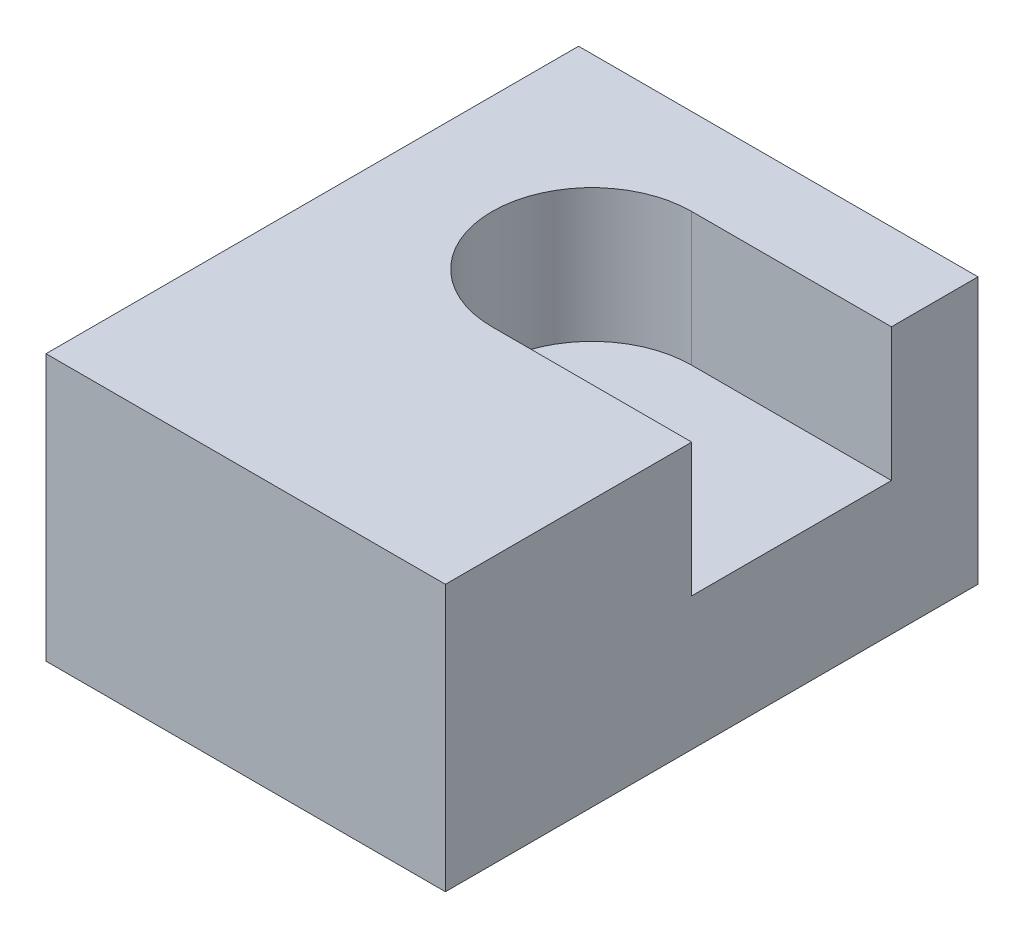
ISO-10303-21;
HEADER;
FILE_DESCRIPTION(('STEP AP214'),'2;1');
FILE_NAME('part.step','',(''),(''),'','','');
FILE_SCHEMA(('AUTOMOTIVE_DESIGN { 1 0 10303 214 1 1 1 1 }'));
ENDSEC;
DATA;
#1=APPLICATION_CONTEXT('core data for automotive mechanical design processes');
#2=APPLICATION_PROTOCOL_DEFINITION('international standard','automotive_design',2000,#1);
#3=PRODUCT_CONTEXT('',#1,'mechanical');
#4=PRODUCT('Part','Part','',(#3));
#5=PRODUCT_RELATED_PRODUCT_CATEGORY('part','',(#4));
#6=PRODUCT_DEFINITION_FORMATION('','',#4);
#7=PRODUCT_DEFINITION_CONTEXT('part definition',#1,'design');
#8=PRODUCT_DEFINITION('design','',#6,#7);
#9=PRODUCT_DEFINITION_SHAPE('','',#8);
#10=(LENGTH_UNIT() NAMED_UNIT(*) SI_UNIT(.MILLI.,.METRE.));
#11=(NAMED_UNIT(*) PLANE_ANGLE_UNIT() SI_UNIT($,.RADIAN.));
#12=(NAMED_UNIT(*) SI_UNIT($,.STERADIAN.) SOLID_ANGLE_UNIT());
#13=UNCERTAINTY_MEASURE_WITH_UNIT(LENGTH_MEASURE(1.E-05),#10,'distance_accuracy_value','');
#14=(GEOMETRIC_REPRESENTATION_CONTEXT(3) GLOBAL_UNCERTAINTY_ASSIGNED_CONTEXT((#13)) GLOBAL_UNIT_ASSIGNED_CONTEXT((#10,
#11,#12)) REPRESENTATION_CONTEXT('',''));
#15=CARTESIAN_POINT('',(0.,0.,0.));
#16=DIRECTION('',(0.,0.,1.));
#17=DIRECTION('',(1.,0.,0.));
#18=AXIS2_PLACEMENT_3D('',#15,#16,#17);
#19=CARTESIAN_POINT('',(19.05,12.7,50.8));
#20=DIRECTION('',(-1.,0.,0.));
#21=DIRECTION('',(0.,0.,1.));
#22=AXIS2_PLACEMENT_3D('',#19,#20,#21);
#23=PLANE('',#22);
#24=DIRECTION('',(0.,0.,-1.));
#25=VECTOR('',#24,1.);
#26=CARTESIAN_POINT('',(19.05,0.,27.305));
#27=LINE('',#26,#25);
#28=CARTESIAN_POINT('',(19.05,0.,27.305));
#29=VERTEX_POINT('',#28);
#30=CARTESIAN_POINT('',(19.05,0.,8.25499999999999));
#31=VERTEX_POINT('',#30);
#32=EDGE_CURVE('E114',#29,#31,#27,.T.);
#33=ORIENTED_EDGE('',*,*,#32,.F.);
#34=DIRECTION('',(0.,1.,0.));
#35=VECTOR('',#34,1.);
#36=CARTESIAN_POINT('',(19.05,0.,27.305));
#37=LINE('',#36,#35);
#38=CARTESIAN_POINT('',(19.05,12.7,27.305));
#39=VERTEX_POINT('',#38);
#40=EDGE_CURVE('E143',#29,#39,#37,.T.);
#41=ORIENTED_EDGE('',*,*,#40,.T.);
#42=DIRECTION('',(0.,0.,-1.));
#43=VECTOR('',#42,1.);
#44=CARTESIAN_POINT('',(19.05,12.7,50.8));
#45=LINE('',#44,#43);
#46=CARTESIAN_POINT('',(19.05,12.7,50.8));
#47=VERTEX_POINT('',#46);
#48=EDGE_CURVE('E11',#47,#39,#45,.T.);
#49=ORIENTED_EDGE('',*,*,#48,.F.);
#50=DIRECTION('',(0.,1.,0.));
#51=VECTOR('',#50,1.);
#52=CARTESIAN_POINT('',(19.05,12.7,50.8));
#53=LINE('',#52,#51);
#54=CARTESIAN_POINT('',(19.05,-12.7,50.8));
#55=VERTEX_POINT('',#54);
#56=EDGE_CURVE('E133',#55,#47,#53,.T.);
#57=ORIENTED_EDGE('',*,*,#56,.F.);
#58=DIRECTION('',(0.,0.,-1.));
#59=VECTOR('',#58,1.);
#60=CARTESIAN_POINT('',(19.05,-12.7,50.8));
#61=LINE('',#60,#59);
#62=CARTESIAN_POINT('',(19.05,-12.7,0.));
#63=VERTEX_POINT('',#62);
#64=EDGE_CURVE('E139',#55,#63,#61,.T.);
#65=ORIENTED_EDGE('',*,*,#64,.T.);
#66=DIRECTION('',(0.,1.,0.));
#67=VECTOR('',#66,1.);
#68=CARTESIAN_POINT('',(19.05,12.7,0.));
#69=LINE('',#68,#67);
#70=CARTESIAN_POINT('',(19.05,12.7,0.));
#71=VERTEX_POINT('',#70);
#72=EDGE_CURVE('E140',#63,#71,#69,.T.);
#73=ORIENTED_EDGE('',*,*,#72,.T.);
#74=CARTESIAN_POINT('',(19.05,12.7,8.25499999999999));
#75=VERTEX_POINT('',#74);
#76=EDGE_CURVE('E41',#75,#71,#45,.T.);
#77=ORIENTED_EDGE('',*,*,#76,.F.);
#78=DIRECTION('',(0.,1.,0.));
#79=VECTOR('',#78,1.);
#80=CARTESIAN_POINT('',(19.05,0.,8.25499999999999));
#81=LINE('',#80,#79);
#82=EDGE_CURVE('E48',#31,#75,#81,.T.);
#83=ORIENTED_EDGE('',*,*,#82,.F.);
#84=EDGE_LOOP('',(#33,#41,#49,#57,#65,#73,#77,#83));
#85=FACE_BOUND('',#84,.T.);
#86=ADVANCED_FACE('F34',(#85),#23,.F.);
#87=CARTESIAN_POINT('',(-19.05,12.7,50.8));
#88=DIRECTION('',(0.,-1.,0.));
#89=DIRECTION('',(0.,0.,-1.));
#90=AXIS2_PLACEMENT_3D('',#87,#88,#89);
#91=PLANE('',#90);
#92=ORIENTED_EDGE('',*,*,#48,.T.);
#93=DIRECTION('',(1.,0.,0.));
#94=VECTOR('',#93,1.);
#95=CARTESIAN_POINT('',(0.,12.7,27.305));
#96=LINE('',#95,#94);
#97=CARTESIAN_POINT('',(0.,12.7,27.305));
#98=VERTEX_POINT('',#97);
#99=EDGE_CURVE('E123',#98,#39,#96,.T.);
#100=ORIENTED_EDGE('',*,*,#99,.F.);
#101=CARTESIAN_POINT('',(0.,12.7,17.78));
#102=DIRECTION('',(0.,1.,0.));
#103=DIRECTION('',(0.,0.,1.));
#104=AXIS2_PLACEMENT_3D('',#101,#102,#103);
#105=CIRCLE('',#104,9.525);
#106=CARTESIAN_POINT('',(0.,12.7,8.255));
#107=VERTEX_POINT('',#106);
#108=EDGE_CURVE('E170',#107,#98,#105,.T.);
#109=ORIENTED_EDGE('',*,*,#108,.F.);
#110=DIRECTION('',(-1.,0.,0.));
#111=VECTOR('',#110,1.);
#112=CARTESIAN_POINT('',(19.05,12.7,8.25499999999999));
#113=LINE('',#112,#111);
#114=EDGE_CURVE('E158',#75,#107,#113,.T.);
#115=ORIENTED_EDGE('',*,*,#114,.F.);
#116=ORIENTED_EDGE('',*,*,#76,.T.);
#117=DIRECTION('',(-1.,0.,0.));
#118=VECTOR('',#117,1.);
#119=CARTESIAN_POINT('',(-19.05,12.7,0.));
#120=LINE('',#119,#118);
#121=CARTESIAN_POINT('',(-19.05,12.7,0.));
#122=VERTEX_POINT('',#121);
#123=EDGE_CURVE('E142',#71,#122,#120,.T.);
#124=ORIENTED_EDGE('',*,*,#123,.T.);
#125=DIRECTION('',(0.,0.,-1.));
#126=VECTOR('',#125,1.);
#127=CARTESIAN_POINT('',(-19.05,12.7,50.8));
#128=LINE('',#127,#126);
#129=CARTESIAN_POINT('',(-19.05,12.7,50.8));
#130=VERTEX_POINT('',#129);
#131=EDGE_CURVE('E150',#130,#122,#128,.T.);
#132=ORIENTED_EDGE('',*,*,#131,.F.);
#133=DIRECTION('',(-1.,0.,0.));
#134=VECTOR('',#133,1.);
#135=CARTESIAN_POINT('',(-19.05,12.7,50.8));
#136=LINE('',#135,#134);
#137=EDGE_CURVE('E85',#47,#130,#136,.T.);
#138=ORIENTED_EDGE('',*,*,#137,.F.);
#139=EDGE_LOOP('',(#92,#100,#109,#115,#116,#124,#132,#138));
#140=FACE_BOUND('',#139,.T.);
#141=ADVANCED_FACE('F156',(#140),#91,.F.);
#142=CARTESIAN_POINT('',(-19.05,12.7,50.8));
#143=DIRECTION('',(1.,0.,0.));
#144=DIRECTION('',(0.,1.,0.));
#145=AXIS2_PLACEMENT_3D('',#142,#143,#144);
#146=PLANE('',#145);
#147=DIRECTION('',(0.,-1.,0.));
#148=VECTOR('',#147,1.);
#149=CARTESIAN_POINT('',(-19.05,12.7,0.));
#150=LINE('',#149,#148);
#151=CARTESIAN_POINT('',(-19.05,-12.7,0.));
#152=VERTEX_POINT('',#151);
#153=EDGE_CURVE('E145',#122,#152,#150,.T.);
#154=ORIENTED_EDGE('',*,*,#153,.T.);
#155=DIRECTION('',(0.,0.,-1.));
#156=VECTOR('',#155,1.);
#157=CARTESIAN_POINT('',(-19.05,-12.7,50.8));
#158=LINE('',#157,#156);
#159=CARTESIAN_POINT('',(-19.05,-12.7,50.8));
#160=VERTEX_POINT('',#159);
#161=EDGE_CURVE('E149',#160,#152,#158,.T.);
#162=ORIENTED_EDGE('',*,*,#161,.F.);
#163=DIRECTION('',(0.,-1.,0.));
#164=VECTOR('',#163,1.);
#165=CARTESIAN_POINT('',(-19.05,12.7,50.8));
#166=LINE('',#165,#164);
#167=EDGE_CURVE('E136',#130,#160,#166,.T.);
#168=ORIENTED_EDGE('',*,*,#167,.F.);
#169=ORIENTED_EDGE('',*,*,#131,.T.);
#170=EDGE_LOOP('',(#154,#162,#168,#169));
#171=FACE_BOUND('',#170,.T.);
#172=ADVANCED_FACE('F166',(#171),#146,.F.);
#173=CARTESIAN_POINT('',(-19.05,-12.7,50.8));
#174=DIRECTION('',(0.,1.,0.));
#175=DIRECTION('',(0.,0.,1.));
#176=AXIS2_PLACEMENT_3D('',#173,#174,#175);
#177=PLANE('',#176);
#178=DIRECTION('',(1.,0.,0.));
#179=VECTOR('',#178,1.);
#180=CARTESIAN_POINT('',(-19.05,-12.7,0.));
#181=LINE('',#180,#179);
#182=EDGE_CURVE('E78',#152,#63,#181,.T.);
#183=ORIENTED_EDGE('',*,*,#182,.T.);
#184=ORIENTED_EDGE('',*,*,#64,.F.);
#185=DIRECTION('',(1.,0.,0.));
#186=VECTOR('',#185,1.);
#187=CARTESIAN_POINT('',(-19.05,-12.7,50.8));
#188=LINE('',#187,#186);
#189=EDGE_CURVE('E57',#160,#55,#188,.T.);
#190=ORIENTED_EDGE('',*,*,#189,.F.);
#191=ORIENTED_EDGE('',*,*,#161,.T.);
#192=EDGE_LOOP('',(#183,#184,#190,#191));
#193=FACE_BOUND('',#192,.T.);
#194=ADVANCED_FACE('F164',(#193),#177,.F.);
#195=CARTESIAN_POINT('',(0.,0.,50.8));
#196=DIRECTION('',(0.,0.,1.));
#197=DIRECTION('',(1.,0.,0.));
#198=AXIS2_PLACEMENT_3D('',#195,#196,#197);
#199=PLANE('',#198);
#200=ORIENTED_EDGE('',*,*,#56,.T.);
#201=ORIENTED_EDGE('',*,*,#137,.T.);
#202=ORIENTED_EDGE('',*,*,#167,.T.);
#203=ORIENTED_EDGE('',*,*,#189,.T.);
#204=EDGE_LOOP('',(#200,#201,#202,#203));
#205=FACE_BOUND('',#204,.T.);
#206=ADVANCED_FACE('F167',(#205),#199,.T.);
#207=CARTESIAN_POINT('',(0.,0.,0.));
#208=DIRECTION('',(0.,0.,1.));
#209=DIRECTION('',(1.,0.,0.));
#210=AXIS2_PLACEMENT_3D('',#207,#208,#209);
#211=PLANE('',#210);
#212=ORIENTED_EDGE('',*,*,#72,.F.);
#213=ORIENTED_EDGE('',*,*,#182,.F.);
#214=ORIENTED_EDGE('',*,*,#153,.F.);
#215=ORIENTED_EDGE('',*,*,#123,.F.);
#216=EDGE_LOOP('',(#212,#213,#214,#215));
#217=FACE_BOUND('',#216,.T.);
#218=ADVANCED_FACE('F161',(#217),#211,.F.);
#219=CARTESIAN_POINT('',(0.,0.,27.305));
#220=DIRECTION('',(0.,0.,1.));
#221=DIRECTION('',(1.,0.,0.));
#222=AXIS2_PLACEMENT_3D('',#219,#220,#221);
#223=PLANE('',#222);
#224=ORIENTED_EDGE('',*,*,#99,.T.);
#225=ORIENTED_EDGE('',*,*,#40,.F.);
#226=DIRECTION('',(1.,0.,0.));
#227=VECTOR('',#226,1.);
#228=CARTESIAN_POINT('',(0.,0.,27.305));
#229=LINE('',#228,#227);
#230=CARTESIAN_POINT('',(0.,0.,27.305));
#231=VERTEX_POINT('',#230);
#232=EDGE_CURVE('E120',#231,#29,#229,.T.);
#233=ORIENTED_EDGE('',*,*,#232,.F.);
#234=DIRECTION('',(0.,1.,0.));
#235=VECTOR('',#234,1.);
#236=CARTESIAN_POINT('',(0.,0.,27.305));
#237=LINE('',#236,#235);
#238=EDGE_CURVE('E128',#231,#98,#237,.T.);
#239=ORIENTED_EDGE('',*,*,#238,.T.);
#240=EDGE_LOOP('',(#224,#225,#233,#239));
#241=FACE_BOUND('',#240,.T.);
#242=ADVANCED_FACE('F176',(#241),#223,.F.);
#243=CARTESIAN_POINT('',(0.,0.,17.78));
#244=DIRECTION('',(0.,1.,0.));
#245=DIRECTION('',(0.,0.,1.));
#246=AXIS2_PLACEMENT_3D('',#243,#244,#245);
#247=CYLINDRICAL_SURFACE('',#246,9.525);
#248=ORIENTED_EDGE('',*,*,#108,.T.);
#249=ORIENTED_EDGE('',*,*,#238,.F.);
#250=CARTESIAN_POINT('',(0.,0.,17.78));
#251=DIRECTION('',(0.,1.,0.));
#252=DIRECTION('',(0.,0.,1.));
#253=AXIS2_PLACEMENT_3D('',#250,#251,#252);
#254=CIRCLE('',#253,9.525);
#255=CARTESIAN_POINT('',(0.,0.,8.255));
#256=VERTEX_POINT('',#255);
#257=EDGE_CURVE('E113',#256,#231,#254,.T.);
#258=ORIENTED_EDGE('',*,*,#257,.F.);
#259=DIRECTION('',(0.,1.,0.));
#260=VECTOR('',#259,1.);
#261=CARTESIAN_POINT('',(0.,0.,8.255));
#262=LINE('',#261,#260);
#263=EDGE_CURVE('E109',#256,#107,#262,.T.);
#264=ORIENTED_EDGE('',*,*,#263,.T.);
#265=EDGE_LOOP('',(#248,#249,#258,#264));
#266=FACE_BOUND('',#265,.T.);
#267=ADVANCED_FACE('F178',(#266),#247,.F.);
#268=CARTESIAN_POINT('',(19.05,0.,8.25499999999999));
#269=DIRECTION('',(0.,0.,-1.));
#270=DIRECTION('',(-1.,0.,0.));
#271=AXIS2_PLACEMENT_3D('',#268,#269,#270);
#272=PLANE('',#271);
#273=ORIENTED_EDGE('',*,*,#114,.T.);
#274=ORIENTED_EDGE('',*,*,#263,.F.);
#275=DIRECTION('',(-1.,0.,0.));
#276=VECTOR('',#275,1.);
#277=CARTESIAN_POINT('',(19.05,0.,8.25499999999999));
#278=LINE('',#277,#276);
#279=EDGE_CURVE('E106',#31,#256,#278,.T.);
#280=ORIENTED_EDGE('',*,*,#279,.F.);
#281=ORIENTED_EDGE('',*,*,#82,.T.);
#282=EDGE_LOOP('',(#273,#274,#280,#281));
#283=FACE_BOUND('',#282,.T.);
#284=ADVANCED_FACE('F108',(#283),#272,.F.);
#285=CARTESIAN_POINT('',(0.,0.,17.78));
#286=DIRECTION('',(0.,1.,0.));
#287=DIRECTION('',(0.,0.,1.));
#288=AXIS2_PLACEMENT_3D('',#285,#286,#287);
#289=PLANE('',#288);
#290=ORIENTED_EDGE('',*,*,#32,.T.);
#291=ORIENTED_EDGE('',*,*,#279,.T.);
#292=ORIENTED_EDGE('',*,*,#257,.T.);
#293=ORIENTED_EDGE('',*,*,#232,.T.);
#294=EDGE_LOOP('',(#290,#291,#292,#293));
#295=FACE_BOUND('',#294,.T.);
#296=ADVANCED_FACE('F118',(#295),#289,.T.);
#297=CLOSED_SHELL('',(#86,#141,#172,#194,#206,#218,#242,#267,#284,#296));
#298=MANIFOLD_SOLID_BREP('B2',#297);
#299=ADVANCED_BREP_SHAPE_REPRESENTATION('',(#18,#298),#14);
#300=SHAPE_DEFINITION_REPRESENTATION(#9,#299);
ENDSEC;
END-ISO-10303-21;
